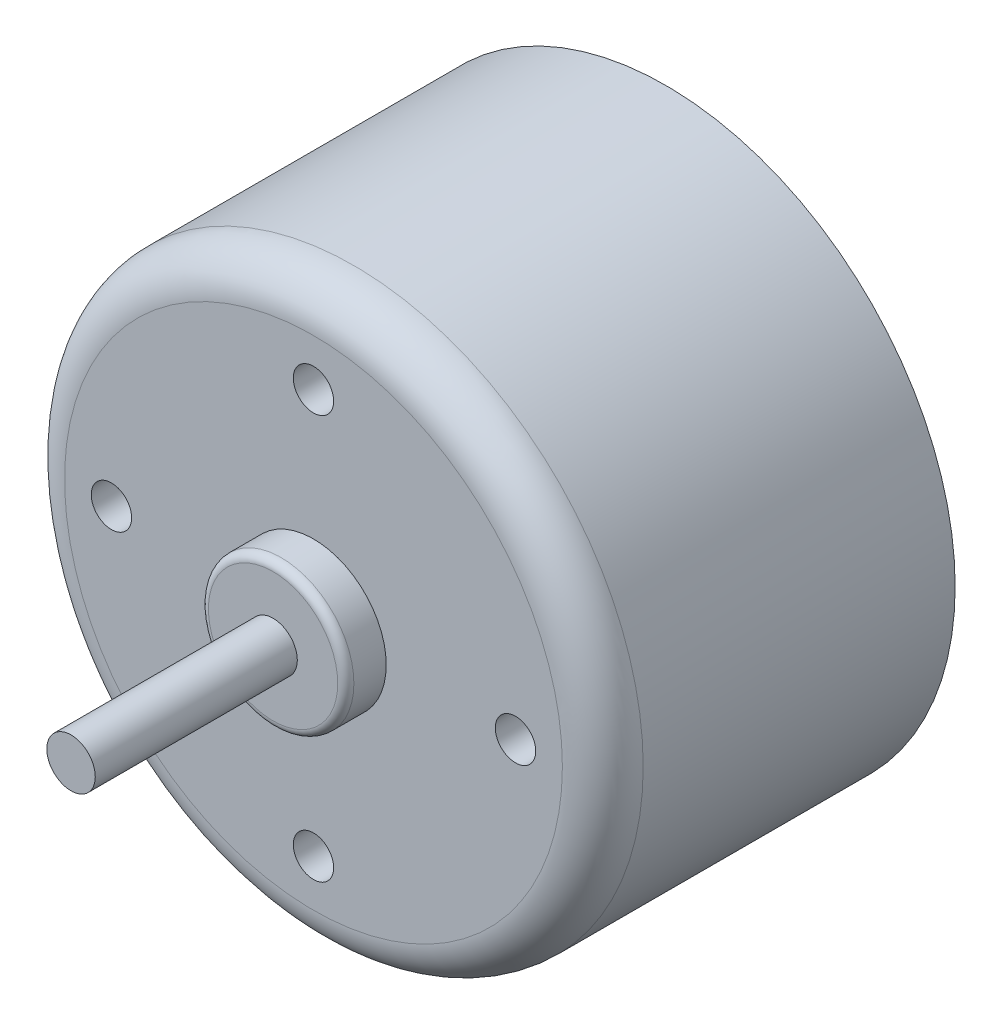
ISO-10303-21;
HEADER;
FILE_DESCRIPTION(('STEP AP214'),'2;1');
FILE_NAME('part.step','',(''),(''),'','','');
FILE_SCHEMA(('AUTOMOTIVE_DESIGN { 1 0 10303 214 1 1 1 1 }'));
ENDSEC;
DATA;
#1=APPLICATION_CONTEXT('core data for automotive mechanical design processes');
#2=APPLICATION_PROTOCOL_DEFINITION('international standard','automotive_design',2000,#1);
#3=PRODUCT_CONTEXT('',#1,'mechanical');
#4=PRODUCT('Part','Part','',(#3));
#5=PRODUCT_RELATED_PRODUCT_CATEGORY('part','',(#4));
#6=PRODUCT_DEFINITION_FORMATION('','',#4);
#7=PRODUCT_DEFINITION_CONTEXT('part definition',#1,'design');
#8=PRODUCT_DEFINITION('design','',#6,#7);
#9=PRODUCT_DEFINITION_SHAPE('','',#8);
#10=(LENGTH_UNIT() NAMED_UNIT(*) SI_UNIT(.MILLI.,.METRE.));
#11=(NAMED_UNIT(*) PLANE_ANGLE_UNIT() SI_UNIT($,.RADIAN.));
#12=(NAMED_UNIT(*) SI_UNIT($,.STERADIAN.) SOLID_ANGLE_UNIT());
#13=UNCERTAINTY_MEASURE_WITH_UNIT(LENGTH_MEASURE(1.E-05),#10,'distance_accuracy_value','');
#14=(GEOMETRIC_REPRESENTATION_CONTEXT(3) GLOBAL_UNCERTAINTY_ASSIGNED_CONTEXT((#13)) GLOBAL_UNIT_ASSIGNED_CONTEXT((#10,
#11,#12)) REPRESENTATION_CONTEXT('',''));
#15=CARTESIAN_POINT('',(0.,0.,0.));
#16=DIRECTION('',(0.,0.,1.));
#17=DIRECTION('',(1.,0.,0.));
#18=AXIS2_PLACEMENT_3D('',#15,#16,#17);
#19=CARTESIAN_POINT('',(0.,0.,21.8));
#20=DIRECTION('',(0.,0.,-1.));
#21=DIRECTION('',(-1.,0.,0.));
#22=AXIS2_PLACEMENT_3D('',#19,#20,#21);
#23=CYLINDRICAL_SURFACE('',#22,17.9);
#24=CARTESIAN_POINT('',(0.,0.,19.3));
#25=DIRECTION('',(0.,0.,1.));
#26=DIRECTION('',(1.,0.,0.));
#27=AXIS2_PLACEMENT_3D('',#24,#25,#26);
#28=CIRCLE('',#27,17.9);
#29=CARTESIAN_POINT('',(17.9,0.,19.3));
#30=VERTEX_POINT('',#29);
#31=EDGE_CURVE('E110',#30,#30,#28,.F.);
#32=ORIENTED_EDGE('',*,*,#31,.T.);
#33=EDGE_LOOP('',(#32));
#34=FACE_BOUND('',#33,.T.);
#35=CARTESIAN_POINT('',(0.,0.,0.));
#36=DIRECTION('',(0.,0.,1.));
#37=DIRECTION('',(1.,0.,0.));
#38=AXIS2_PLACEMENT_3D('',#35,#36,#37);
#39=CIRCLE('',#38,17.9);
#40=CARTESIAN_POINT('',(17.9,0.,0.));
#41=VERTEX_POINT('',#40);
#42=EDGE_CURVE('E104',#41,#41,#39,.T.);
#43=ORIENTED_EDGE('',*,*,#42,.T.);
#44=EDGE_LOOP('',(#43));
#45=FACE_BOUND('',#44,.T.);
#46=ADVANCED_FACE('F43',(#34,#45),#23,.T.);
#47=CARTESIAN_POINT('',(0.,0.,21.8));
#48=DIRECTION('',(0.,0.,1.));
#49=DIRECTION('',(1.,0.,0.));
#50=AXIS2_PLACEMENT_3D('',#47,#48,#49);
#51=PLANE('',#50);
#52=CARTESIAN_POINT('',(0.,12.5,21.8));
#53=DIRECTION('',(0.,0.,1.));
#54=DIRECTION('',(1.,0.,0.));
#55=AXIS2_PLACEMENT_3D('',#52,#53,#54);
#56=CIRCLE('',#55,1.24999999999999);
#57=CARTESIAN_POINT('',(1.24999999999999,12.5,21.8));
#58=VERTEX_POINT('',#57);
#59=EDGE_CURVE('E77',#58,#58,#56,.T.);
#60=ORIENTED_EDGE('',*,*,#59,.F.);
#61=EDGE_LOOP('',(#60));
#62=FACE_BOUND('',#61,.T.);
#63=CARTESIAN_POINT('',(0.,-12.5,21.8));
#64=DIRECTION('',(0.,0.,1.));
#65=DIRECTION('',(1.,0.,0.));
#66=AXIS2_PLACEMENT_3D('',#63,#64,#65);
#67=CIRCLE('',#66,1.24999999999999);
#68=CARTESIAN_POINT('',(1.24999999999999,-12.5,21.8));
#69=VERTEX_POINT('',#68);
#70=EDGE_CURVE('E76',#69,#69,#67,.T.);
#71=ORIENTED_EDGE('',*,*,#70,.F.);
#72=EDGE_LOOP('',(#71));
#73=FACE_BOUND('',#72,.T.);
#74=CARTESIAN_POINT('',(12.5,0.,21.8));
#75=DIRECTION('',(0.,0.,1.));
#76=DIRECTION('',(1.,0.,0.));
#77=AXIS2_PLACEMENT_3D('',#74,#75,#76);
#78=CIRCLE('',#77,1.24999999999999);
#79=CARTESIAN_POINT('',(13.75,0.,21.8));
#80=VERTEX_POINT('',#79);
#81=EDGE_CURVE('E89',#80,#80,#78,.T.);
#82=ORIENTED_EDGE('',*,*,#81,.F.);
#83=EDGE_LOOP('',(#82));
#84=FACE_BOUND('',#83,.T.);
#85=CARTESIAN_POINT('',(-12.5,0.,21.8));
#86=DIRECTION('',(0.,0.,1.));
#87=DIRECTION('',(1.,0.,0.));
#88=AXIS2_PLACEMENT_3D('',#85,#86,#87);
#89=CIRCLE('',#88,1.24999999999999);
#90=CARTESIAN_POINT('',(-11.25,0.,21.8));
#91=VERTEX_POINT('',#90);
#92=EDGE_CURVE('E95',#91,#91,#89,.T.);
#93=ORIENTED_EDGE('',*,*,#92,.F.);
#94=EDGE_LOOP('',(#93));
#95=FACE_BOUND('',#94,.T.);
#96=CARTESIAN_POINT('',(0.,0.,21.8));
#97=DIRECTION('',(0.,0.,1.));
#98=DIRECTION('',(1.,0.,0.));
#99=AXIS2_PLACEMENT_3D('',#96,#97,#98);
#100=CIRCLE('',#99,4.5);
#101=CARTESIAN_POINT('',(4.5,0.,21.8));
#102=VERTEX_POINT('',#101);
#103=EDGE_CURVE('E101',#102,#102,#100,.T.);
#104=ORIENTED_EDGE('',*,*,#103,.F.);
#105=EDGE_LOOP('',(#104));
#106=FACE_BOUND('',#105,.T.);
#107=CARTESIAN_POINT('',(0.,0.,21.8));
#108=DIRECTION('',(0.,0.,1.));
#109=DIRECTION('',(1.,0.,0.));
#110=AXIS2_PLACEMENT_3D('',#107,#108,#109);
#111=CIRCLE('',#110,15.4);
#112=CARTESIAN_POINT('',(15.4,0.,21.8));
#113=VERTEX_POINT('',#112);
#114=EDGE_CURVE('E107',#113,#113,#111,.T.);
#115=ORIENTED_EDGE('',*,*,#114,.T.);
#116=EDGE_LOOP('',(#115));
#117=FACE_BOUND('',#116,.T.);
#118=ADVANCED_FACE('F146',(#62,#73,#84,#95,#106,#117),#51,.T.);
#119=CARTESIAN_POINT('',(0.,0.,0.));
#120=DIRECTION('',(0.,0.,1.));
#121=DIRECTION('',(1.,0.,0.));
#122=AXIS2_PLACEMENT_3D('',#119,#120,#121);
#123=PLANE('',#122);
#124=CARTESIAN_POINT('',(0.,0.,0.));
#125=DIRECTION('',(0.,0.,-1.));
#126=DIRECTION('',(-1.,0.,0.));
#127=AXIS2_PLACEMENT_3D('',#124,#125,#126);
#128=CIRCLE('',#127,6.35);
#129=CARTESIAN_POINT('',(-6.35,0.,0.));
#130=VERTEX_POINT('',#129);
#131=EDGE_CURVE('E52',#130,#130,#128,.T.);
#132=ORIENTED_EDGE('',*,*,#131,.F.);
#133=EDGE_LOOP('',(#132));
#134=FACE_BOUND('',#133,.T.);
#135=ORIENTED_EDGE('',*,*,#42,.F.);
#136=EDGE_LOOP('',(#135));
#137=FACE_BOUND('',#136,.T.);
#138=ADVANCED_FACE('F152',(#134,#137),#123,.F.);
#139=CARTESIAN_POINT('',(0.,0.,19.3));
#140=DIRECTION('',(0.,0.,1.));
#141=DIRECTION('',(1.,0.,0.));
#142=AXIS2_PLACEMENT_3D('',#139,#140,#141);
#143=TOROIDAL_SURFACE('',#142,15.4,2.5);
#144=ORIENTED_EDGE('',*,*,#31,.F.);
#145=EDGE_LOOP('',(#144));
#146=FACE_BOUND('',#145,.T.);
#147=ORIENTED_EDGE('',*,*,#114,.F.);
#148=EDGE_LOOP('',(#147));
#149=FACE_BOUND('',#148,.T.);
#150=ADVANCED_FACE('F157',(#146,#149),#143,.T.);
#151=CARTESIAN_POINT('',(0.,0.,24.3));
#152=DIRECTION('',(0.,0.,-1.));
#153=DIRECTION('',(-1.,0.,0.));
#154=AXIS2_PLACEMENT_3D('',#151,#152,#153);
#155=CYLINDRICAL_SURFACE('',#154,4.5);
#156=CARTESIAN_POINT('',(0.,0.,23.8));
#157=DIRECTION('',(0.,0.,1.));
#158=DIRECTION('',(1.,0.,0.));
#159=AXIS2_PLACEMENT_3D('',#156,#157,#158);
#160=CIRCLE('',#159,4.5);
#161=CARTESIAN_POINT('',(4.5,0.,23.8));
#162=VERTEX_POINT('',#161);
#163=EDGE_CURVE('E47',#162,#162,#160,.F.);
#164=ORIENTED_EDGE('',*,*,#163,.T.);
#165=EDGE_LOOP('',(#164));
#166=FACE_BOUND('',#165,.T.);
#167=ORIENTED_EDGE('',*,*,#103,.T.);
#168=EDGE_LOOP('',(#167));
#169=FACE_BOUND('',#168,.T.);
#170=ADVANCED_FACE('F159',(#166,#169),#155,.T.);
#171=CARTESIAN_POINT('',(0.,0.,24.3));
#172=DIRECTION('',(0.,0.,1.));
#173=DIRECTION('',(1.,0.,0.));
#174=AXIS2_PLACEMENT_3D('',#171,#172,#173);
#175=PLANE('',#174);
#176=CARTESIAN_POINT('',(0.,0.,24.3));
#177=DIRECTION('',(0.,0.,1.));
#178=DIRECTION('',(1.,0.,0.));
#179=AXIS2_PLACEMENT_3D('',#176,#177,#178);
#180=CIRCLE('',#179,1.5);
#181=CARTESIAN_POINT('',(1.5,0.,24.3));
#182=VERTEX_POINT('',#181);
#183=EDGE_CURVE('E126',#182,#182,#180,.T.);
#184=ORIENTED_EDGE('',*,*,#183,.F.);
#185=EDGE_LOOP('',(#184));
#186=FACE_BOUND('',#185,.T.);
#187=CARTESIAN_POINT('',(0.,0.,24.3));
#188=DIRECTION('',(0.,0.,1.));
#189=DIRECTION('',(1.,0.,0.));
#190=AXIS2_PLACEMENT_3D('',#187,#188,#189);
#191=CIRCLE('',#190,4.);
#192=CARTESIAN_POINT('',(4.,0.,24.3));
#193=VERTEX_POINT('',#192);
#194=EDGE_CURVE('E112',#193,#193,#191,.T.);
#195=ORIENTED_EDGE('',*,*,#194,.T.);
#196=EDGE_LOOP('',(#195));
#197=FACE_BOUND('',#196,.T.);
#198=ADVANCED_FACE('F165',(#186,#197),#175,.T.);
#199=CARTESIAN_POINT('',(0.,0.,23.8));
#200=DIRECTION('',(0.,0.,1.));
#201=DIRECTION('',(1.,0.,0.));
#202=AXIS2_PLACEMENT_3D('',#199,#200,#201);
#203=TOROIDAL_SURFACE('',#202,4.,0.5);
#204=ORIENTED_EDGE('',*,*,#163,.F.);
#205=EDGE_LOOP('',(#204));
#206=FACE_BOUND('',#205,.T.);
#207=ORIENTED_EDGE('',*,*,#194,.F.);
#208=EDGE_LOOP('',(#207));
#209=FACE_BOUND('',#208,.T.);
#210=ADVANCED_FACE('F45',(#206,#209),#203,.T.);
#211=CARTESIAN_POINT('',(-12.5,0.,14.18));
#212=DIRECTION('',(0.,0.,1.));
#213=DIRECTION('',(1.,0.,0.));
#214=AXIS2_PLACEMENT_3D('',#211,#212,#213);
#215=CONICAL_SURFACE('',#214,1.24999999999999,1.02974425867665);
#216=CARTESIAN_POINT('',(-12.5,0.,13.4289242262156));
#217=VERTEX_POINT('',#216);
#218=VERTEX_LOOP('',#217);
#219=FACE_BOUND('',#218,.T.);
#220=CARTESIAN_POINT('',(-12.5,0.,14.18));
#221=DIRECTION('',(0.,0.,1.));
#222=DIRECTION('',(1.,0.,0.));
#223=AXIS2_PLACEMENT_3D('',#220,#221,#222);
#224=CIRCLE('',#223,1.24999999999999);
#225=CARTESIAN_POINT('',(-11.25,0.,14.18));
#226=VERTEX_POINT('',#225);
#227=EDGE_CURVE('E98',#226,#226,#224,.T.);
#228=ORIENTED_EDGE('',*,*,#227,.T.);
#229=EDGE_LOOP('',(#228));
#230=FACE_BOUND('',#229,.T.);
#231=ADVANCED_FACE('F194',(#219,#230),#215,.F.);
#232=CARTESIAN_POINT('',(-12.5,0.,21.8));
#233=DIRECTION('',(0.,0.,1.));
#234=DIRECTION('',(1.,0.,0.));
#235=AXIS2_PLACEMENT_3D('',#232,#233,#234);
#236=CYLINDRICAL_SURFACE('',#235,1.24999999999999);
#237=ORIENTED_EDGE('',*,*,#227,.F.);
#238=EDGE_LOOP('',(#237));
#239=FACE_BOUND('',#238,.T.);
#240=ORIENTED_EDGE('',*,*,#92,.T.);
#241=EDGE_LOOP('',(#240));
#242=FACE_BOUND('',#241,.T.);
#243=ADVANCED_FACE('F199',(#239,#242),#236,.F.);
#244=CARTESIAN_POINT('',(12.5,0.,14.18));
#245=DIRECTION('',(0.,0.,1.));
#246=DIRECTION('',(1.,0.,0.));
#247=AXIS2_PLACEMENT_3D('',#244,#245,#246);
#248=CONICAL_SURFACE('',#247,1.24999999999999,1.02974425867665);
#249=CARTESIAN_POINT('',(12.5,0.,13.4289242262156));
#250=VERTEX_POINT('',#249);
#251=VERTEX_LOOP('',#250);
#252=FACE_BOUND('',#251,.T.);
#253=CARTESIAN_POINT('',(12.5,0.,14.18));
#254=DIRECTION('',(0.,0.,1.));
#255=DIRECTION('',(1.,0.,0.));
#256=AXIS2_PLACEMENT_3D('',#253,#254,#255);
#257=CIRCLE('',#256,1.24999999999999);
#258=CARTESIAN_POINT('',(13.75,0.,14.18));
#259=VERTEX_POINT('',#258);
#260=EDGE_CURVE('E92',#259,#259,#257,.T.);
#261=ORIENTED_EDGE('',*,*,#260,.T.);
#262=EDGE_LOOP('',(#261));
#263=FACE_BOUND('',#262,.T.);
#264=ADVANCED_FACE('F210',(#252,#263),#248,.F.);
#265=CARTESIAN_POINT('',(12.5,0.,21.8));
#266=DIRECTION('',(0.,0.,1.));
#267=DIRECTION('',(1.,0.,0.));
#268=AXIS2_PLACEMENT_3D('',#265,#266,#267);
#269=CYLINDRICAL_SURFACE('',#268,1.24999999999999);
#270=ORIENTED_EDGE('',*,*,#260,.F.);
#271=EDGE_LOOP('',(#270));
#272=FACE_BOUND('',#271,.T.);
#273=ORIENTED_EDGE('',*,*,#81,.T.);
#274=EDGE_LOOP('',(#273));
#275=FACE_BOUND('',#274,.T.);
#276=ADVANCED_FACE('F223',(#272,#275),#269,.F.);
#277=CARTESIAN_POINT('',(0.,-12.5,14.18));
#278=DIRECTION('',(0.,0.,1.));
#279=DIRECTION('',(1.,0.,0.));
#280=AXIS2_PLACEMENT_3D('',#277,#278,#279);
#281=CONICAL_SURFACE('',#280,1.24999999999999,1.02974425867665);
#282=CARTESIAN_POINT('',(0.,-12.5,13.4289242262156));
#283=VERTEX_POINT('',#282);
#284=VERTEX_LOOP('',#283);
#285=FACE_BOUND('',#284,.T.);
#286=CARTESIAN_POINT('',(0.,-12.5,14.18));
#287=DIRECTION('',(0.,0.,1.));
#288=DIRECTION('',(1.,0.,0.));
#289=AXIS2_PLACEMENT_3D('',#286,#287,#288);
#290=CIRCLE('',#289,1.24999999999999);
#291=CARTESIAN_POINT('',(1.24999999999999,-12.5,14.18));
#292=VERTEX_POINT('',#291);
#293=EDGE_CURVE('E80',#292,#292,#290,.T.);
#294=ORIENTED_EDGE('',*,*,#293,.T.);
#295=EDGE_LOOP('',(#294));
#296=FACE_BOUND('',#295,.T.);
#297=ADVANCED_FACE('F233',(#285,#296),#281,.F.);
#298=CARTESIAN_POINT('',(0.,-12.5,21.8));
#299=DIRECTION('',(0.,0.,1.));
#300=DIRECTION('',(1.,0.,0.));
#301=AXIS2_PLACEMENT_3D('',#298,#299,#300);
#302=CYLINDRICAL_SURFACE('',#301,1.24999999999999);
#303=ORIENTED_EDGE('',*,*,#293,.F.);
#304=EDGE_LOOP('',(#303));
#305=FACE_BOUND('',#304,.T.);
#306=ORIENTED_EDGE('',*,*,#70,.T.);
#307=EDGE_LOOP('',(#306));
#308=FACE_BOUND('',#307,.T.);
#309=ADVANCED_FACE('F70',(#305,#308),#302,.F.);
#310=CARTESIAN_POINT('',(0.,12.5,14.18));
#311=DIRECTION('',(0.,0.,1.));
#312=DIRECTION('',(1.,0.,0.));
#313=AXIS2_PLACEMENT_3D('',#310,#311,#312);
#314=CONICAL_SURFACE('',#313,1.24999999999999,1.02974425867665);
#315=CARTESIAN_POINT('',(0.,12.5,13.4289242262156));
#316=VERTEX_POINT('',#315);
#317=VERTEX_LOOP('',#316);
#318=FACE_BOUND('',#317,.T.);
#319=CARTESIAN_POINT('',(0.,12.5,14.18));
#320=DIRECTION('',(0.,0.,1.));
#321=DIRECTION('',(1.,0.,0.));
#322=AXIS2_PLACEMENT_3D('',#319,#320,#321);
#323=CIRCLE('',#322,1.24999999999999);
#324=CARTESIAN_POINT('',(1.24999999999999,12.5,14.18));
#325=VERTEX_POINT('',#324);
#326=EDGE_CURVE('E74',#325,#325,#323,.T.);
#327=ORIENTED_EDGE('',*,*,#326,.T.);
#328=EDGE_LOOP('',(#327));
#329=FACE_BOUND('',#328,.T.);
#330=ADVANCED_FACE('F66',(#318,#329),#314,.F.);
#331=CARTESIAN_POINT('',(0.,12.5,21.8));
#332=DIRECTION('',(0.,0.,1.));
#333=DIRECTION('',(1.,0.,0.));
#334=AXIS2_PLACEMENT_3D('',#331,#332,#333);
#335=CYLINDRICAL_SURFACE('',#334,1.24999999999999);
#336=ORIENTED_EDGE('',*,*,#326,.F.);
#337=EDGE_LOOP('',(#336));
#338=FACE_BOUND('',#337,.T.);
#339=ORIENTED_EDGE('',*,*,#59,.T.);
#340=EDGE_LOOP('',(#339));
#341=FACE_BOUND('',#340,.T.);
#342=ADVANCED_FACE('F69',(#338,#341),#335,.F.);
#343=CARTESIAN_POINT('',(0.,0.,56.0426406871193));
#344=DIRECTION('',(0.,0.,-1.));
#345=DIRECTION('',(-1.,0.,0.));
#346=AXIS2_PLACEMENT_3D('',#343,#344,#345);
#347=CYLINDRICAL_SURFACE('',#346,1.5);
#348=ORIENTED_EDGE('',*,*,#183,.T.);
#349=EDGE_LOOP('',(#348));
#350=FACE_BOUND('',#349,.T.);
#351=CARTESIAN_POINT('',(0.,0.,36.8));
#352=DIRECTION('',(0.,0.,1.));
#353=DIRECTION('',(1.,0.,0.));
#354=AXIS2_PLACEMENT_3D('',#351,#352,#353);
#355=CIRCLE('',#354,1.5);
#356=CARTESIAN_POINT('',(1.5,0.,36.8));
#357=VERTEX_POINT('',#356);
#358=EDGE_CURVE('E83',#357,#357,#355,.T.);
#359=ORIENTED_EDGE('',*,*,#358,.F.);
#360=EDGE_LOOP('',(#359));
#361=FACE_BOUND('',#360,.T.);
#362=ADVANCED_FACE('F133',(#350,#361),#347,.T.);
#363=CARTESIAN_POINT('',(0.,0.,36.8));
#364=DIRECTION('',(0.,0.,1.));
#365=DIRECTION('',(1.,0.,0.));
#366=AXIS2_PLACEMENT_3D('',#363,#364,#365);
#367=PLANE('',#366);
#368=ORIENTED_EDGE('',*,*,#358,.T.);
#369=EDGE_LOOP('',(#368));
#370=FACE_BOUND('',#369,.T.);
#371=ADVANCED_FACE('F131',(#370),#367,.T.);
#372=CARTESIAN_POINT('',(0.,0.,-2.));
#373=DIRECTION('',(0.,0.,1.));
#374=DIRECTION('',(1.,0.,0.));
#375=AXIS2_PLACEMENT_3D('',#372,#373,#374);
#376=CYLINDRICAL_SURFACE('',#375,6.35);
#377=CARTESIAN_POINT('',(0.,0.,-2.));
#378=DIRECTION('',(0.,0.,-1.));
#379=DIRECTION('',(-1.,0.,0.));
#380=AXIS2_PLACEMENT_3D('',#377,#378,#379);
#381=CIRCLE('',#380,6.35);
#382=CARTESIAN_POINT('',(-6.35,0.,-2.));
#383=VERTEX_POINT('',#382);
#384=EDGE_CURVE('E125',#383,#383,#381,.T.);
#385=ORIENTED_EDGE('',*,*,#384,.F.);
#386=EDGE_LOOP('',(#385));
#387=FACE_BOUND('',#386,.T.);
#388=ORIENTED_EDGE('',*,*,#131,.T.);
#389=EDGE_LOOP('',(#388));
#390=FACE_BOUND('',#389,.T.);
#391=ADVANCED_FACE('F141',(#387,#390),#376,.T.);
#392=CARTESIAN_POINT('',(0.,0.,-2.));
#393=DIRECTION('',(0.,0.,-1.));
#394=DIRECTION('',(-1.,0.,0.));
#395=AXIS2_PLACEMENT_3D('',#392,#393,#394);
#396=PLANE('',#395);
#397=CARTESIAN_POINT('',(0.,0.,-2.));
#398=DIRECTION('',(0.,0.,-1.));
#399=DIRECTION('',(-1.,0.,0.));
#400=AXIS2_PLACEMENT_3D('',#397,#398,#399);
#401=CIRCLE('',#400,1.5);
#402=CARTESIAN_POINT('',(-1.5,0.,-2.));
#403=VERTEX_POINT('',#402);
#404=EDGE_CURVE('E12',#403,#403,#401,.T.);
#405=ORIENTED_EDGE('',*,*,#404,.F.);
#406=EDGE_LOOP('',(#405));
#407=FACE_BOUND('',#406,.T.);
#408=ORIENTED_EDGE('',*,*,#384,.T.);
#409=EDGE_LOOP('',(#408));
#410=FACE_BOUND('',#409,.T.);
#411=ADVANCED_FACE('F304',(#407,#410),#396,.T.);
#412=CARTESIAN_POINT('',(0.,0.,-3.));
#413=DIRECTION('',(0.,0.,1.));
#414=DIRECTION('',(1.,0.,0.));
#415=AXIS2_PLACEMENT_3D('',#412,#413,#414);
#416=CYLINDRICAL_SURFACE('',#415,1.5);
#417=CARTESIAN_POINT('',(0.,0.,-3.));
#418=DIRECTION('',(0.,0.,-1.));
#419=DIRECTION('',(-1.,0.,0.));
#420=AXIS2_PLACEMENT_3D('',#417,#418,#419);
#421=CIRCLE('',#420,1.5);
#422=CARTESIAN_POINT('',(-1.5,0.,-3.));
#423=VERTEX_POINT('',#422);
#424=EDGE_CURVE('E387',#423,#423,#421,.T.);
#425=ORIENTED_EDGE('',*,*,#424,.F.);
#426=EDGE_LOOP('',(#425));
#427=FACE_BOUND('',#426,.T.);
#428=ORIENTED_EDGE('',*,*,#404,.T.);
#429=EDGE_LOOP('',(#428));
#430=FACE_BOUND('',#429,.T.);
#431=ADVANCED_FACE('F310',(#427,#430),#416,.T.);
#432=CARTESIAN_POINT('',(0.,0.,-3.));
#433=DIRECTION('',(0.,0.,-1.));
#434=DIRECTION('',(-1.,0.,0.));
#435=AXIS2_PLACEMENT_3D('',#432,#433,#434);
#436=PLANE('',#435);
#437=ORIENTED_EDGE('',*,*,#424,.T.);
#438=EDGE_LOOP('',(#437));
#439=FACE_BOUND('',#438,.T.);
#440=ADVANCED_FACE('F318',(#439),#436,.T.);
#441=CLOSED_SHELL('',(#46,#118,#138,#150,#170,#198,#210,#231,#243,#264,#276,#297,#309,#330,#342,
#362,#371,#391,#411,#431,#440));
#442=MANIFOLD_SOLID_BREP('B2',#441);
#443=ADVANCED_BREP_SHAPE_REPRESENTATION('',(#18,#442),#14);
#444=SHAPE_DEFINITION_REPRESENTATION(#9,#443);
ENDSEC;
END-ISO-10303-21;
